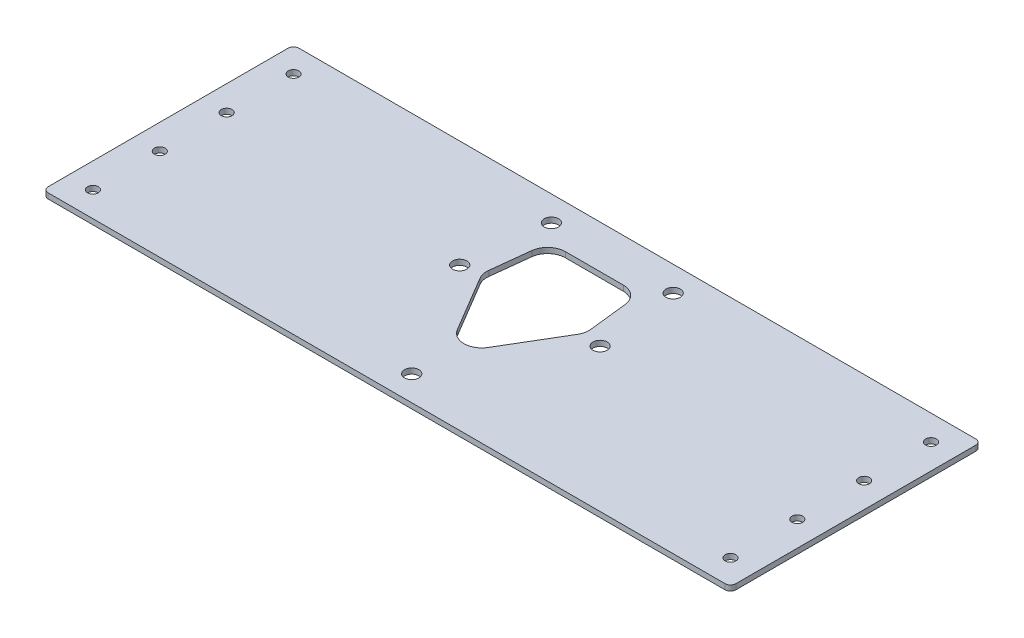
ISO-10303-21;
HEADER;
FILE_DESCRIPTION(('STEP AP214'),'2;1');
FILE_NAME('part.step','',(''),(''),'','','');
FILE_SCHEMA(('AUTOMOTIVE_DESIGN { 1 0 10303 214 1 1 1 1 }'));
ENDSEC;
DATA;
#1=APPLICATION_CONTEXT('core data for automotive mechanical design processes');
#2=APPLICATION_PROTOCOL_DEFINITION('international standard','automotive_design',2000,#1);
#3=PRODUCT_CONTEXT('',#1,'mechanical');
#4=PRODUCT('Part','Part','',(#3));
#5=PRODUCT_RELATED_PRODUCT_CATEGORY('part','',(#4));
#6=PRODUCT_DEFINITION_FORMATION('','',#4);
#7=PRODUCT_DEFINITION_CONTEXT('part definition',#1,'design');
#8=PRODUCT_DEFINITION('design','',#6,#7);
#9=PRODUCT_DEFINITION_SHAPE('','',#8);
#10=(LENGTH_UNIT() NAMED_UNIT(*) SI_UNIT(.MILLI.,.METRE.));
#11=(NAMED_UNIT(*) PLANE_ANGLE_UNIT() SI_UNIT($,.RADIAN.));
#12=(NAMED_UNIT(*) SI_UNIT($,.STERADIAN.) SOLID_ANGLE_UNIT());
#13=UNCERTAINTY_MEASURE_WITH_UNIT(LENGTH_MEASURE(1.E-05),#10,'distance_accuracy_value','');
#14=(GEOMETRIC_REPRESENTATION_CONTEXT(3) GLOBAL_UNCERTAINTY_ASSIGNED_CONTEXT((#13)) GLOBAL_UNIT_ASSIGNED_CONTEXT((#10,
#11,#12)) REPRESENTATION_CONTEXT('',''));
#15=CARTESIAN_POINT('',(0.,0.,0.));
#16=DIRECTION('',(0.,0.,1.));
#17=DIRECTION('',(1.,0.,0.));
#18=AXIS2_PLACEMENT_3D('',#15,#16,#17);
#19=CARTESIAN_POINT('',(0.,3.,0.));
#20=DIRECTION('',(0.,1.,0.));
#21=DIRECTION('',(0.,0.,1.));
#22=AXIS2_PLACEMENT_3D('',#19,#20,#21);
#23=PLANE('',#22);
#24=CARTESIAN_POINT('',(178.,3.,-18.6666666666667));
#25=DIRECTION('',(0.,1.,0.));
#26=DIRECTION('',(0.,0.,-1.));
#27=AXIS2_PLACEMENT_3D('',#24,#25,#26);
#28=CIRCLE('',#27,2.99999999999999);
#29=CARTESIAN_POINT('',(178.,3.,-21.6666666666667));
#30=VERTEX_POINT('',#29);
#31=EDGE_CURVE('E754',#30,#30,#28,.T.);
#32=ORIENTED_EDGE('',*,*,#31,.F.);
#33=EDGE_LOOP('',(#32));
#34=FACE_BOUND('',#33,.T.);
#35=CARTESIAN_POINT('',(-178.,3.,-18.6666666666667));
#36=DIRECTION('',(0.,1.,0.));
#37=DIRECTION('',(0.,0.,1.));
#38=AXIS2_PLACEMENT_3D('',#35,#36,#37);
#39=CIRCLE('',#38,2.99999999999999);
#40=CARTESIAN_POINT('',(-178.,3.,-15.6666666666667));
#41=VERTEX_POINT('',#40);
#42=EDGE_CURVE('E762',#41,#41,#39,.T.);
#43=ORIENTED_EDGE('',*,*,#42,.F.);
#44=EDGE_LOOP('',(#43));
#45=FACE_BOUND('',#44,.T.);
#46=CARTESIAN_POINT('',(-178.,3.,-56.));
#47=DIRECTION('',(0.,1.,0.));
#48=DIRECTION('',(0.,0.,-1.));
#49=AXIS2_PLACEMENT_3D('',#46,#47,#48);
#50=CIRCLE('',#49,2.99999999999999);
#51=CARTESIAN_POINT('',(-178.,3.,-59.));
#52=VERTEX_POINT('',#51);
#53=EDGE_CURVE('E770',#52,#52,#50,.T.);
#54=ORIENTED_EDGE('',*,*,#53,.F.);
#55=EDGE_LOOP('',(#54));
#56=FACE_BOUND('',#55,.T.);
#57=CARTESIAN_POINT('',(-178.,3.,56.));
#58=DIRECTION('',(0.,1.,0.));
#59=DIRECTION('',(0.,0.,1.));
#60=AXIS2_PLACEMENT_3D('',#57,#58,#59);
#61=CIRCLE('',#60,2.99999999999999);
#62=CARTESIAN_POINT('',(-178.,3.,59.));
#63=VERTEX_POINT('',#62);
#64=EDGE_CURVE('E210',#63,#63,#61,.T.);
#65=ORIENTED_EDGE('',*,*,#64,.F.);
#66=EDGE_LOOP('',(#65));
#67=FACE_BOUND('',#66,.T.);
#68=CARTESIAN_POINT('',(39.2,3.,-10.));
#69=DIRECTION('',(0.,1.,0.));
#70=DIRECTION('',(0.,0.,-1.));
#71=AXIS2_PLACEMENT_3D('',#68,#69,#70);
#72=CIRCLE('',#71,4.00000000000001);
#73=CARTESIAN_POINT('',(39.2,3.,-14.));
#74=VERTEX_POINT('',#73);
#75=EDGE_CURVE('E257',#74,#74,#72,.T.);
#76=ORIENTED_EDGE('',*,*,#75,.F.);
#77=EDGE_LOOP('',(#76));
#78=FACE_BOUND('',#77,.T.);
#79=CARTESIAN_POINT('',(-39.2,3.,-9.99999999999999));
#80=DIRECTION('',(0.,1.,0.));
#81=DIRECTION('',(0.,0.,1.));
#82=AXIS2_PLACEMENT_3D('',#79,#80,#81);
#83=CIRCLE('',#82,4.00000000000001);
#84=CARTESIAN_POINT('',(-39.2,3.,-5.99999999999999));
#85=VERTEX_POINT('',#84);
#86=EDGE_CURVE('E269',#85,#85,#83,.T.);
#87=ORIENTED_EDGE('',*,*,#86,.F.);
#88=EDGE_LOOP('',(#87));
#89=FACE_BOUND('',#88,.T.);
#90=DIRECTION('',(-1.,0.,0.));
#91=VECTOR('',#90,1.);
#92=CARTESIAN_POINT('',(-192.,3.,-70.));
#93=LINE('',#92,#91);
#94=CARTESIAN_POINT('',(189.,3.,-70.));
#95=VERTEX_POINT('',#94);
#96=CARTESIAN_POINT('',(-189.,3.,-70.));
#97=VERTEX_POINT('',#96);
#98=EDGE_CURVE('E284',#95,#97,#93,.T.);
#99=ORIENTED_EDGE('',*,*,#98,.T.);
#100=CARTESIAN_POINT('',(-189.,3.,-67.));
#101=DIRECTION('',(0.,1.,0.));
#102=DIRECTION('',(0.,0.,1.));
#103=AXIS2_PLACEMENT_3D('',#100,#101,#102);
#104=CIRCLE('',#103,3.);
#105=CARTESIAN_POINT('',(-192.,3.,-67.));
#106=VERTEX_POINT('',#105);
#107=EDGE_CURVE('E324',#97,#106,#104,.T.);
#108=ORIENTED_EDGE('',*,*,#107,.T.);
#109=DIRECTION('',(0.,0.,1.));
#110=VECTOR('',#109,1.);
#111=CARTESIAN_POINT('',(-192.,3.,-70.));
#112=LINE('',#111,#110);
#113=CARTESIAN_POINT('',(-192.,3.,67.));
#114=VERTEX_POINT('',#113);
#115=EDGE_CURVE('E288',#106,#114,#112,.T.);
#116=ORIENTED_EDGE('',*,*,#115,.T.);
#117=CARTESIAN_POINT('',(-189.,3.,67.));
#118=DIRECTION('',(0.,1.,0.));
#119=DIRECTION('',(0.,0.,1.));
#120=AXIS2_PLACEMENT_3D('',#117,#118,#119);
#121=CIRCLE('',#120,3.);
#122=CARTESIAN_POINT('',(-189.,3.,70.));
#123=VERTEX_POINT('',#122);
#124=EDGE_CURVE('E58',#114,#123,#121,.T.);
#125=ORIENTED_EDGE('',*,*,#124,.T.);
#126=DIRECTION('',(1.,0.,0.));
#127=VECTOR('',#126,1.);
#128=CARTESIAN_POINT('',(-192.,3.,70.));
#129=LINE('',#128,#127);
#130=CARTESIAN_POINT('',(189.,3.,70.));
#131=VERTEX_POINT('',#130);
#132=EDGE_CURVE('E290',#123,#131,#129,.T.);
#133=ORIENTED_EDGE('',*,*,#132,.T.);
#134=CARTESIAN_POINT('',(189.,3.,67.));
#135=DIRECTION('',(0.,1.,0.));
#136=DIRECTION('',(0.,0.,1.));
#137=AXIS2_PLACEMENT_3D('',#134,#135,#136);
#138=CIRCLE('',#137,3.);
#139=CARTESIAN_POINT('',(192.,3.,67.));
#140=VERTEX_POINT('',#139);
#141=EDGE_CURVE('E320',#131,#140,#138,.T.);
#142=ORIENTED_EDGE('',*,*,#141,.T.);
#143=DIRECTION('',(0.,0.,-1.));
#144=VECTOR('',#143,1.);
#145=CARTESIAN_POINT('',(192.,3.,-70.));
#146=LINE('',#145,#144);
#147=CARTESIAN_POINT('',(192.,3.,-67.));
#148=VERTEX_POINT('',#147);
#149=EDGE_CURVE('E281',#140,#148,#146,.T.);
#150=ORIENTED_EDGE('',*,*,#149,.T.);
#151=CARTESIAN_POINT('',(189.,3.,-67.));
#152=DIRECTION('',(0.,1.,0.));
#153=DIRECTION('',(0.,0.,1.));
#154=AXIS2_PLACEMENT_3D('',#151,#152,#153);
#155=CIRCLE('',#154,3.);
#156=EDGE_CURVE('E322',#148,#95,#155,.T.);
#157=ORIENTED_EDGE('',*,*,#156,.T.);
#158=EDGE_LOOP('',(#99,#108,#116,#125,#133,#142,#150,#157));
#159=FACE_BOUND('',#158,.T.);
#160=CARTESIAN_POINT('',(-34.,3.,-56.));
#161=DIRECTION('',(0.,1.,0.));
#162=DIRECTION('',(0.,0.,1.));
#163=AXIS2_PLACEMENT_3D('',#160,#161,#162);
#164=CIRCLE('',#163,4.);
#165=CARTESIAN_POINT('',(-34.,3.,-52.));
#166=VERTEX_POINT('',#165);
#167=EDGE_CURVE('E275',#166,#166,#164,.T.);
#168=ORIENTED_EDGE('',*,*,#167,.F.);
#169=EDGE_LOOP('',(#168));
#170=FACE_BOUND('',#169,.T.);
#171=CARTESIAN_POINT('',(0.,3.,56.));
#172=DIRECTION('',(0.,1.,0.));
#173=DIRECTION('',(0.,0.,1.));
#174=AXIS2_PLACEMENT_3D('',#171,#172,#173);
#175=CIRCLE('',#174,4.);
#176=CARTESIAN_POINT('',(0.,3.,60.));
#177=VERTEX_POINT('',#176);
#178=EDGE_CURVE('E263',#177,#177,#175,.T.);
#179=ORIENTED_EDGE('',*,*,#178,.F.);
#180=EDGE_LOOP('',(#179));
#181=FACE_BOUND('',#180,.T.);
#182=CARTESIAN_POINT('',(34.,3.,-56.));
#183=DIRECTION('',(0.,1.,0.));
#184=DIRECTION('',(0.,0.,-1.));
#185=AXIS2_PLACEMENT_3D('',#182,#183,#184);
#186=CIRCLE('',#185,3.99999999999999);
#187=CARTESIAN_POINT('',(34.,3.,-60.));
#188=VERTEX_POINT('',#187);
#189=EDGE_CURVE('E251',#188,#188,#186,.T.);
#190=ORIENTED_EDGE('',*,*,#189,.F.);
#191=EDGE_LOOP('',(#190));
#192=FACE_BOUND('',#191,.T.);
#193=DIRECTION('',(0.510659143261206,0.,0.859783251409174));
#194=VECTOR('',#193,1.);
#195=CARTESIAN_POINT('',(-8.59783251409182,3.,21.9415235709565));
#196=LINE('',#195,#194);
#197=CARTESIAN_POINT('',(-27.1692899423675,3.,-9.32674658889544));
#198=VERTEX_POINT('',#197);
#199=CARTESIAN_POINT('',(-8.59783251409182,3.,21.9415235709565));
#200=VERTEX_POINT('',#199);
#201=EDGE_CURVE('E174',#198,#200,#196,.T.);
#202=ORIENTED_EDGE('',*,*,#201,.F.);
#203=CARTESIAN_POINT('',(-18.5714574282758,3.,-14.4333380215075));
#204=DIRECTION('',(0.,1.,0.));
#205=DIRECTION('',(0.,0.,1.));
#206=AXIS2_PLACEMENT_3D('',#203,#204,#205);
#207=CIRCLE('',#206,10.);
#208=CARTESIAN_POINT('',(-28.5081692085094,3.,-15.5566184836209));
#209=VERTEX_POINT('',#208);
#210=EDGE_CURVE('E164',#209,#198,#207,.T.);
#211=ORIENTED_EDGE('',*,*,#210,.F.);
#212=DIRECTION('',(-0.112328046211337,0.,0.993671178023366));
#213=VECTOR('',#212,1.);
#214=CARTESIAN_POINT('',(-28.5081692085094,3.,-15.5566184836209));
#215=LINE('',#214,#213);
#216=CARTESIAN_POINT('',(-26.0701987239842,3.,-37.1232804621133));
#217=VERTEX_POINT('',#216);
#218=EDGE_CURVE('E206',#217,#209,#215,.T.);
#219=ORIENTED_EDGE('',*,*,#218,.F.);
#220=CARTESIAN_POINT('',(-16.1334869437505,3.,-36.));
#221=DIRECTION('',(0.,1.,0.));
#222=DIRECTION('',(0.,0.,-1.));
#223=AXIS2_PLACEMENT_3D('',#220,#221,#222);
#224=CIRCLE('',#223,10.);
#225=CARTESIAN_POINT('',(-16.1334869437505,3.,-46.));
#226=VERTEX_POINT('',#225);
#227=EDGE_CURVE('E203',#226,#217,#224,.T.);
#228=ORIENTED_EDGE('',*,*,#227,.F.);
#229=DIRECTION('',(-1.,0.,0.));
#230=VECTOR('',#229,1.);
#231=CARTESIAN_POINT('',(-16.1334869437505,3.,-46.));
#232=LINE('',#231,#230);
#233=CARTESIAN_POINT('',(16.1334869437505,3.,-46.));
#234=VERTEX_POINT('',#233);
#235=EDGE_CURVE('E201',#234,#226,#232,.T.);
#236=ORIENTED_EDGE('',*,*,#235,.F.);
#237=CARTESIAN_POINT('',(16.1334869437505,3.,-36.));
#238=DIRECTION('',(0.,1.,0.));
#239=DIRECTION('',(0.,0.,-1.));
#240=AXIS2_PLACEMENT_3D('',#237,#238,#239);
#241=CIRCLE('',#240,10.);
#242=CARTESIAN_POINT('',(26.0701987239842,3.,-37.1232804621133));
#243=VERTEX_POINT('',#242);
#244=EDGE_CURVE('E199',#243,#234,#241,.T.);
#245=ORIENTED_EDGE('',*,*,#244,.F.);
#246=DIRECTION('',(-0.112328046211338,0.,-0.993671178023366));
#247=VECTOR('',#246,1.);
#248=CARTESIAN_POINT('',(26.0701987239842,3.,-37.1232804621133));
#249=LINE('',#248,#247);
#250=CARTESIAN_POINT('',(28.5081692085094,3.,-15.556618483621));
#251=VERTEX_POINT('',#250);
#252=EDGE_CURVE('E197',#251,#243,#249,.T.);
#253=ORIENTED_EDGE('',*,*,#252,.F.);
#254=CARTESIAN_POINT('',(18.5714574282758,3.,-14.4333380215075));
#255=DIRECTION('',(0.,1.,0.));
#256=DIRECTION('',(0.,0.,-1.));
#257=AXIS2_PLACEMENT_3D('',#254,#255,#256);
#258=CIRCLE('',#257,10.);
#259=CARTESIAN_POINT('',(27.1692899423675,3.,-9.32674658889544));
#260=VERTEX_POINT('',#259);
#261=EDGE_CURVE('E195',#260,#251,#258,.T.);
#262=ORIENTED_EDGE('',*,*,#261,.F.);
#263=DIRECTION('',(0.510659143261207,0.,-0.859783251409174));
#264=VECTOR('',#263,1.);
#265=CARTESIAN_POINT('',(27.1692899423675,3.,-9.32674658889544));
#266=LINE('',#265,#264);
#267=CARTESIAN_POINT('',(8.59783251409179,3.,21.9415235709565));
#268=VERTEX_POINT('',#267);
#269=EDGE_CURVE('E190',#268,#260,#266,.T.);
#270=ORIENTED_EDGE('',*,*,#269,.F.);
#271=CARTESIAN_POINT('',(0.,3.,16.8349321383445));
#272=DIRECTION('',(0.,1.,0.));
#273=DIRECTION('',(0.,0.,-1.));
#274=AXIS2_PLACEMENT_3D('',#271,#272,#273);
#275=CIRCLE('',#274,10.);
#276=EDGE_CURVE('E188',#200,#268,#275,.T.);
#277=ORIENTED_EDGE('',*,*,#276,.F.);
#278=EDGE_LOOP('',(#202,#211,#219,#228,#236,#245,#253,#262,#270,#277));
#279=FACE_BOUND('',#278,.T.);
#280=CARTESIAN_POINT('',(178.,3.,56.));
#281=DIRECTION('',(0.,1.,0.));
#282=DIRECTION('',(0.,0.,-1.));
#283=AXIS2_PLACEMENT_3D('',#280,#281,#282);
#284=CIRCLE('',#283,2.99999999999999);
#285=CARTESIAN_POINT('',(178.,3.,53.));
#286=VERTEX_POINT('',#285);
#287=EDGE_CURVE('E774',#286,#286,#284,.T.);
#288=ORIENTED_EDGE('',*,*,#287,.F.);
#289=EDGE_LOOP('',(#288));
#290=FACE_BOUND('',#289,.T.);
#291=CARTESIAN_POINT('',(178.,3.,-56.));
#292=DIRECTION('',(0.,1.,0.));
#293=DIRECTION('',(0.,0.,1.));
#294=AXIS2_PLACEMENT_3D('',#291,#292,#293);
#295=CIRCLE('',#294,2.99999999999999);
#296=CARTESIAN_POINT('',(178.,3.,-53.));
#297=VERTEX_POINT('',#296);
#298=EDGE_CURVE('E766',#297,#297,#295,.T.);
#299=ORIENTED_EDGE('',*,*,#298,.F.);
#300=EDGE_LOOP('',(#299));
#301=FACE_BOUND('',#300,.T.);
#302=CARTESIAN_POINT('',(-178.,3.,18.6666666666667));
#303=DIRECTION('',(0.,1.,0.));
#304=DIRECTION('',(0.,0.,-1.));
#305=AXIS2_PLACEMENT_3D('',#302,#303,#304);
#306=CIRCLE('',#305,2.99999999999999);
#307=CARTESIAN_POINT('',(-178.,3.,15.6666666666667));
#308=VERTEX_POINT('',#307);
#309=EDGE_CURVE('E758',#308,#308,#306,.T.);
#310=ORIENTED_EDGE('',*,*,#309,.F.);
#311=EDGE_LOOP('',(#310));
#312=FACE_BOUND('',#311,.T.);
#313=CARTESIAN_POINT('',(178.,3.,18.6666666666666));
#314=DIRECTION('',(0.,1.,0.));
#315=DIRECTION('',(0.,0.,1.));
#316=AXIS2_PLACEMENT_3D('',#313,#314,#315);
#317=CIRCLE('',#316,2.99999999999999);
#318=CARTESIAN_POINT('',(178.,3.,21.6666666666666));
#319=VERTEX_POINT('',#318);
#320=EDGE_CURVE('E749',#319,#319,#317,.T.);
#321=ORIENTED_EDGE('',*,*,#320,.F.);
#322=EDGE_LOOP('',(#321));
#323=FACE_BOUND('',#322,.T.);
#324=ADVANCED_FACE('F38',(#34,#45,#56,#67,#78,#89,#159,#170,#181,#192,#279,#290,#301,#312,#323),
#23,.T.);
#325=CARTESIAN_POINT('',(0.,0.,0.));
#326=DIRECTION('',(0.,1.,0.));
#327=DIRECTION('',(0.,0.,1.));
#328=AXIS2_PLACEMENT_3D('',#325,#326,#327);
#329=PLANE('',#328);
#330=CARTESIAN_POINT('',(34.,0.,-56.));
#331=DIRECTION('',(0.,1.,0.));
#332=DIRECTION('',(0.,0.,-1.));
#333=AXIS2_PLACEMENT_3D('',#330,#331,#332);
#334=CIRCLE('',#333,3.99999999999999);
#335=CARTESIAN_POINT('',(34.,0.,-60.));
#336=VERTEX_POINT('',#335);
#337=EDGE_CURVE('E182',#336,#336,#334,.T.);
#338=ORIENTED_EDGE('',*,*,#337,.T.);
#339=EDGE_LOOP('',(#338));
#340=FACE_BOUND('',#339,.T.);
#341=CARTESIAN_POINT('',(39.2,0.,-10.));
#342=DIRECTION('',(0.,1.,0.));
#343=DIRECTION('',(0.,0.,-1.));
#344=AXIS2_PLACEMENT_3D('',#341,#342,#343);
#345=CIRCLE('',#344,4.00000000000001);
#346=CARTESIAN_POINT('',(39.2,0.,-14.));
#347=VERTEX_POINT('',#346);
#348=EDGE_CURVE('E254',#347,#347,#345,.T.);
#349=ORIENTED_EDGE('',*,*,#348,.T.);
#350=EDGE_LOOP('',(#349));
#351=FACE_BOUND('',#350,.T.);
#352=CARTESIAN_POINT('',(0.,0.,56.));
#353=DIRECTION('',(0.,1.,0.));
#354=DIRECTION('',(0.,0.,1.));
#355=AXIS2_PLACEMENT_3D('',#352,#353,#354);
#356=CIRCLE('',#355,4.);
#357=CARTESIAN_POINT('',(0.,0.,60.));
#358=VERTEX_POINT('',#357);
#359=EDGE_CURVE('E260',#358,#358,#356,.T.);
#360=ORIENTED_EDGE('',*,*,#359,.T.);
#361=EDGE_LOOP('',(#360));
#362=FACE_BOUND('',#361,.T.);
#363=CARTESIAN_POINT('',(-39.2,0.,-9.99999999999999));
#364=DIRECTION('',(0.,1.,0.));
#365=DIRECTION('',(0.,0.,1.));
#366=AXIS2_PLACEMENT_3D('',#363,#364,#365);
#367=CIRCLE('',#366,4.00000000000001);
#368=CARTESIAN_POINT('',(-39.2,0.,-5.99999999999999));
#369=VERTEX_POINT('',#368);
#370=EDGE_CURVE('E266',#369,#369,#367,.T.);
#371=ORIENTED_EDGE('',*,*,#370,.T.);
#372=EDGE_LOOP('',(#371));
#373=FACE_BOUND('',#372,.T.);
#374=CARTESIAN_POINT('',(-34.,0.,-56.));
#375=DIRECTION('',(0.,1.,0.));
#376=DIRECTION('',(0.,0.,1.));
#377=AXIS2_PLACEMENT_3D('',#374,#375,#376);
#378=CIRCLE('',#377,4.);
#379=CARTESIAN_POINT('',(-34.,0.,-52.));
#380=VERTEX_POINT('',#379);
#381=EDGE_CURVE('E272',#380,#380,#378,.T.);
#382=ORIENTED_EDGE('',*,*,#381,.T.);
#383=EDGE_LOOP('',(#382));
#384=FACE_BOUND('',#383,.T.);
#385=DIRECTION('',(0.,0.,1.));
#386=VECTOR('',#385,1.);
#387=CARTESIAN_POINT('',(-192.,0.,-70.));
#388=LINE('',#387,#386);
#389=CARTESIAN_POINT('',(-192.,0.,-67.));
#390=VERTEX_POINT('',#389);
#391=CARTESIAN_POINT('',(-192.,0.,67.));
#392=VERTEX_POINT('',#391);
#393=EDGE_CURVE('E298',#390,#392,#388,.T.);
#394=ORIENTED_EDGE('',*,*,#393,.F.);
#395=CARTESIAN_POINT('',(-189.,0.,-67.));
#396=DIRECTION('',(0.,1.,0.));
#397=DIRECTION('',(0.,0.,1.));
#398=AXIS2_PLACEMENT_3D('',#395,#396,#397);
#399=CIRCLE('',#398,3.);
#400=CARTESIAN_POINT('',(-189.,0.,-70.));
#401=VERTEX_POINT('',#400);
#402=EDGE_CURVE('E312',#390,#401,#399,.F.);
#403=ORIENTED_EDGE('',*,*,#402,.T.);
#404=DIRECTION('',(-1.,0.,0.));
#405=VECTOR('',#404,1.);
#406=CARTESIAN_POINT('',(-192.,0.,-70.));
#407=LINE('',#406,#405);
#408=CARTESIAN_POINT('',(189.,0.,-70.));
#409=VERTEX_POINT('',#408);
#410=EDGE_CURVE('E295',#409,#401,#407,.T.);
#411=ORIENTED_EDGE('',*,*,#410,.F.);
#412=CARTESIAN_POINT('',(189.,0.,-67.));
#413=DIRECTION('',(0.,1.,0.));
#414=DIRECTION('',(0.,0.,1.));
#415=AXIS2_PLACEMENT_3D('',#412,#413,#414);
#416=CIRCLE('',#415,3.);
#417=CARTESIAN_POINT('',(192.,0.,-67.));
#418=VERTEX_POINT('',#417);
#419=EDGE_CURVE('E310',#409,#418,#416,.F.);
#420=ORIENTED_EDGE('',*,*,#419,.T.);
#421=DIRECTION('',(0.,0.,-1.));
#422=VECTOR('',#421,1.);
#423=CARTESIAN_POINT('',(192.,0.,-70.));
#424=LINE('',#423,#422);
#425=CARTESIAN_POINT('',(192.,0.,67.));
#426=VERTEX_POINT('',#425);
#427=EDGE_CURVE('E278',#426,#418,#424,.T.);
#428=ORIENTED_EDGE('',*,*,#427,.F.);
#429=CARTESIAN_POINT('',(189.,0.,67.));
#430=DIRECTION('',(0.,1.,0.));
#431=DIRECTION('',(0.,0.,1.));
#432=AXIS2_PLACEMENT_3D('',#429,#430,#431);
#433=CIRCLE('',#432,3.);
#434=CARTESIAN_POINT('',(189.,0.,70.));
#435=VERTEX_POINT('',#434);
#436=EDGE_CURVE('E308',#426,#435,#433,.F.);
#437=ORIENTED_EDGE('',*,*,#436,.T.);
#438=DIRECTION('',(1.,0.,0.));
#439=VECTOR('',#438,1.);
#440=CARTESIAN_POINT('',(-192.,0.,70.));
#441=LINE('',#440,#439);
#442=CARTESIAN_POINT('',(-189.,0.,70.));
#443=VERTEX_POINT('',#442);
#444=EDGE_CURVE('E285',#443,#435,#441,.T.);
#445=ORIENTED_EDGE('',*,*,#444,.F.);
#446=CARTESIAN_POINT('',(-189.,0.,67.));
#447=DIRECTION('',(0.,1.,0.));
#448=DIRECTION('',(0.,0.,1.));
#449=AXIS2_PLACEMENT_3D('',#446,#447,#448);
#450=CIRCLE('',#449,3.);
#451=EDGE_CURVE('E306',#443,#392,#450,.F.);
#452=ORIENTED_EDGE('',*,*,#451,.T.);
#453=EDGE_LOOP('',(#394,#403,#411,#420,#428,#437,#445,#452));
#454=FACE_BOUND('',#453,.T.);
#455=CARTESIAN_POINT('',(-18.5714574282758,0.,-14.4333380215075));
#456=DIRECTION('',(0.,1.,0.));
#457=DIRECTION('',(0.,0.,1.));
#458=AXIS2_PLACEMENT_3D('',#455,#456,#457);
#459=CIRCLE('',#458,10.);
#460=CARTESIAN_POINT('',(-28.5081692085094,0.,-15.5566184836209));
#461=VERTEX_POINT('',#460);
#462=CARTESIAN_POINT('',(-27.1692899423675,0.,-9.32674658889544));
#463=VERTEX_POINT('',#462);
#464=EDGE_CURVE('E208',#461,#463,#459,.T.);
#465=ORIENTED_EDGE('',*,*,#464,.T.);
#466=DIRECTION('',(0.510659143261206,0.,0.859783251409174));
#467=VECTOR('',#466,1.);
#468=CARTESIAN_POINT('',(-8.59783251409182,0.,21.9415235709565));
#469=LINE('',#468,#467);
#470=CARTESIAN_POINT('',(-8.59783251409182,0.,21.9415235709565));
#471=VERTEX_POINT('',#470);
#472=EDGE_CURVE('E181',#463,#471,#469,.T.);
#473=ORIENTED_EDGE('',*,*,#472,.T.);
#474=CARTESIAN_POINT('',(0.,0.,16.8349321383445));
#475=DIRECTION('',(0.,1.,0.));
#476=DIRECTION('',(0.,0.,-1.));
#477=AXIS2_PLACEMENT_3D('',#474,#475,#476);
#478=CIRCLE('',#477,10.);
#479=CARTESIAN_POINT('',(8.59783251409179,0.,21.9415235709565));
#480=VERTEX_POINT('',#479);
#481=EDGE_CURVE('E212',#471,#480,#478,.T.);
#482=ORIENTED_EDGE('',*,*,#481,.T.);
#483=DIRECTION('',(0.510659143261207,0.,-0.859783251409174));
#484=VECTOR('',#483,1.);
#485=CARTESIAN_POINT('',(27.1692899423675,0.,-9.32674658889544));
#486=LINE('',#485,#484);
#487=CARTESIAN_POINT('',(27.1692899423675,0.,-9.32674658889544));
#488=VERTEX_POINT('',#487);
#489=EDGE_CURVE('E215',#480,#488,#486,.T.);
#490=ORIENTED_EDGE('',*,*,#489,.T.);
#491=CARTESIAN_POINT('',(18.5714574282758,0.,-14.4333380215075));
#492=DIRECTION('',(0.,1.,0.));
#493=DIRECTION('',(0.,0.,-1.));
#494=AXIS2_PLACEMENT_3D('',#491,#492,#493);
#495=CIRCLE('',#494,10.);
#496=CARTESIAN_POINT('',(28.5081692085094,0.,-15.556618483621));
#497=VERTEX_POINT('',#496);
#498=EDGE_CURVE('E218',#488,#497,#495,.T.);
#499=ORIENTED_EDGE('',*,*,#498,.T.);
#500=DIRECTION('',(-0.112328046211338,0.,-0.993671178023366));
#501=VECTOR('',#500,1.);
#502=CARTESIAN_POINT('',(26.0701987239842,0.,-37.1232804621133));
#503=LINE('',#502,#501);
#504=CARTESIAN_POINT('',(26.0701987239842,0.,-37.1232804621133));
#505=VERTEX_POINT('',#504);
#506=EDGE_CURVE('E221',#497,#505,#503,.T.);
#507=ORIENTED_EDGE('',*,*,#506,.T.);
#508=CARTESIAN_POINT('',(16.1334869437505,0.,-36.));
#509=DIRECTION('',(0.,1.,0.));
#510=DIRECTION('',(0.,0.,-1.));
#511=AXIS2_PLACEMENT_3D('',#508,#509,#510);
#512=CIRCLE('',#511,10.);
#513=CARTESIAN_POINT('',(16.1334869437505,0.,-46.));
#514=VERTEX_POINT('',#513);
#515=EDGE_CURVE('E224',#505,#514,#512,.T.);
#516=ORIENTED_EDGE('',*,*,#515,.T.);
#517=DIRECTION('',(-1.,0.,0.));
#518=VECTOR('',#517,1.);
#519=CARTESIAN_POINT('',(-16.1334869437505,0.,-46.));
#520=LINE('',#519,#518);
#521=CARTESIAN_POINT('',(-16.1334869437505,0.,-46.));
#522=VERTEX_POINT('',#521);
#523=EDGE_CURVE('E227',#514,#522,#520,.T.);
#524=ORIENTED_EDGE('',*,*,#523,.T.);
#525=CARTESIAN_POINT('',(-16.1334869437505,0.,-36.));
#526=DIRECTION('',(0.,1.,0.));
#527=DIRECTION('',(0.,0.,-1.));
#528=AXIS2_PLACEMENT_3D('',#525,#526,#527);
#529=CIRCLE('',#528,10.);
#530=CARTESIAN_POINT('',(-26.0701987239842,0.,-37.1232804621133));
#531=VERTEX_POINT('',#530);
#532=EDGE_CURVE('E230',#522,#531,#529,.T.);
#533=ORIENTED_EDGE('',*,*,#532,.T.);
#534=DIRECTION('',(-0.112328046211337,0.,0.993671178023366));
#535=VECTOR('',#534,1.);
#536=CARTESIAN_POINT('',(-28.5081692085094,0.,-15.5566184836209));
#537=LINE('',#536,#535);
#538=EDGE_CURVE('E175',#531,#461,#537,.T.);
#539=ORIENTED_EDGE('',*,*,#538,.T.);
#540=EDGE_LOOP('',(#465,#473,#482,#490,#499,#507,#516,#524,#533,#539));
#541=FACE_BOUND('',#540,.T.);
#542=CARTESIAN_POINT('',(-178.,0.,56.));
#543=DIRECTION('',(0.,1.,0.));
#544=DIRECTION('',(0.,0.,1.));
#545=AXIS2_PLACEMENT_3D('',#542,#543,#544);
#546=CIRCLE('',#545,2.99999999999999);
#547=CARTESIAN_POINT('',(-178.,0.,59.));
#548=VERTEX_POINT('',#547);
#549=EDGE_CURVE('E720',#548,#548,#546,.T.);
#550=ORIENTED_EDGE('',*,*,#549,.T.);
#551=EDGE_LOOP('',(#550));
#552=FACE_BOUND('',#551,.T.);
#553=CARTESIAN_POINT('',(178.,0.,56.));
#554=DIRECTION('',(0.,1.,0.));
#555=DIRECTION('',(0.,0.,-1.));
#556=AXIS2_PLACEMENT_3D('',#553,#554,#555);
#557=CIRCLE('',#556,2.99999999999999);
#558=CARTESIAN_POINT('',(178.,0.,53.));
#559=VERTEX_POINT('',#558);
#560=EDGE_CURVE('E724',#559,#559,#557,.T.);
#561=ORIENTED_EDGE('',*,*,#560,.T.);
#562=EDGE_LOOP('',(#561));
#563=FACE_BOUND('',#562,.T.);
#564=CARTESIAN_POINT('',(-178.,0.,-56.));
#565=DIRECTION('',(0.,1.,0.));
#566=DIRECTION('',(0.,0.,-1.));
#567=AXIS2_PLACEMENT_3D('',#564,#565,#566);
#568=CIRCLE('',#567,2.99999999999999);
#569=CARTESIAN_POINT('',(-178.,0.,-59.));
#570=VERTEX_POINT('',#569);
#571=EDGE_CURVE('E728',#570,#570,#568,.T.);
#572=ORIENTED_EDGE('',*,*,#571,.T.);
#573=EDGE_LOOP('',(#572));
#574=FACE_BOUND('',#573,.T.);
#575=CARTESIAN_POINT('',(178.,0.,-56.));
#576=DIRECTION('',(0.,1.,0.));
#577=DIRECTION('',(0.,0.,1.));
#578=AXIS2_PLACEMENT_3D('',#575,#576,#577);
#579=CIRCLE('',#578,2.99999999999999);
#580=CARTESIAN_POINT('',(178.,0.,-53.));
#581=VERTEX_POINT('',#580);
#582=EDGE_CURVE('E732',#581,#581,#579,.T.);
#583=ORIENTED_EDGE('',*,*,#582,.T.);
#584=EDGE_LOOP('',(#583));
#585=FACE_BOUND('',#584,.T.);
#586=CARTESIAN_POINT('',(-178.,0.,-18.6666666666667));
#587=DIRECTION('',(0.,1.,0.));
#588=DIRECTION('',(0.,0.,1.));
#589=AXIS2_PLACEMENT_3D('',#586,#587,#588);
#590=CIRCLE('',#589,2.99999999999999);
#591=CARTESIAN_POINT('',(-178.,0.,-15.6666666666667));
#592=VERTEX_POINT('',#591);
#593=EDGE_CURVE('E736',#592,#592,#590,.T.);
#594=ORIENTED_EDGE('',*,*,#593,.T.);
#595=EDGE_LOOP('',(#594));
#596=FACE_BOUND('',#595,.T.);
#597=CARTESIAN_POINT('',(-178.,0.,18.6666666666667));
#598=DIRECTION('',(0.,1.,0.));
#599=DIRECTION('',(0.,0.,-1.));
#600=AXIS2_PLACEMENT_3D('',#597,#598,#599);
#601=CIRCLE('',#600,2.99999999999999);
#602=CARTESIAN_POINT('',(-178.,0.,15.6666666666667));
#603=VERTEX_POINT('',#602);
#604=EDGE_CURVE('E740',#603,#603,#601,.T.);
#605=ORIENTED_EDGE('',*,*,#604,.T.);
#606=EDGE_LOOP('',(#605));
#607=FACE_BOUND('',#606,.T.);
#608=CARTESIAN_POINT('',(178.,0.,-18.6666666666667));
#609=DIRECTION('',(0.,1.,0.));
#610=DIRECTION('',(0.,0.,-1.));
#611=AXIS2_PLACEMENT_3D('',#608,#609,#610);
#612=CIRCLE('',#611,2.99999999999999);
#613=CARTESIAN_POINT('',(178.,0.,-21.6666666666667));
#614=VERTEX_POINT('',#613);
#615=EDGE_CURVE('E744',#614,#614,#612,.T.);
#616=ORIENTED_EDGE('',*,*,#615,.T.);
#617=EDGE_LOOP('',(#616));
#618=FACE_BOUND('',#617,.T.);
#619=CARTESIAN_POINT('',(178.,0.,18.6666666666666));
#620=DIRECTION('',(0.,1.,0.));
#621=DIRECTION('',(0.,0.,1.));
#622=AXIS2_PLACEMENT_3D('',#619,#620,#621);
#623=CIRCLE('',#622,2.99999999999999);
#624=CARTESIAN_POINT('',(178.,0.,21.6666666666666));
#625=VERTEX_POINT('',#624);
#626=EDGE_CURVE('E747',#625,#625,#623,.T.);
#627=ORIENTED_EDGE('',*,*,#626,.T.);
#628=EDGE_LOOP('',(#627));
#629=FACE_BOUND('',#628,.T.);
#630=ADVANCED_FACE('F337',(#340,#351,#362,#373,#384,#454,#541,#552,#563,#574,#585,#596,#607,
#618,#629),#329,.F.);
#631=CARTESIAN_POINT('',(192.,3.,-70.));
#632=DIRECTION('',(-1.,0.,0.));
#633=DIRECTION('',(0.,0.,1.));
#634=AXIS2_PLACEMENT_3D('',#631,#632,#633);
#635=PLANE('',#634);
#636=ORIENTED_EDGE('',*,*,#427,.T.);
#637=DIRECTION('',(0.,-1.,0.));
#638=VECTOR('',#637,1.);
#639=CARTESIAN_POINT('',(192.,3.,-67.));
#640=LINE('',#639,#638);
#641=EDGE_CURVE('E329',#418,#148,#640,.F.);
#642=ORIENTED_EDGE('',*,*,#641,.T.);
#643=ORIENTED_EDGE('',*,*,#149,.F.);
#644=DIRECTION('',(0.,-1.,0.));
#645=VECTOR('',#644,1.);
#646=CARTESIAN_POINT('',(192.,3.,67.));
#647=LINE('',#646,#645);
#648=EDGE_CURVE('E326',#140,#426,#647,.T.);
#649=ORIENTED_EDGE('',*,*,#648,.T.);
#650=EDGE_LOOP('',(#636,#642,#643,#649));
#651=FACE_BOUND('',#650,.T.);
#652=ADVANCED_FACE('F346',(#651),#635,.F.);
#653=CARTESIAN_POINT('',(-192.,3.,-70.));
#654=DIRECTION('',(0.,0.,1.));
#655=DIRECTION('',(1.,0.,0.));
#656=AXIS2_PLACEMENT_3D('',#653,#654,#655);
#657=PLANE('',#656);
#658=ORIENTED_EDGE('',*,*,#410,.T.);
#659=DIRECTION('',(0.,-1.,0.));
#660=VECTOR('',#659,1.);
#661=CARTESIAN_POINT('',(-189.,3.,-70.));
#662=LINE('',#661,#660);
#663=EDGE_CURVE('E317',#401,#97,#662,.F.);
#664=ORIENTED_EDGE('',*,*,#663,.T.);
#665=ORIENTED_EDGE('',*,*,#98,.F.);
#666=DIRECTION('',(0.,-1.,0.));
#667=VECTOR('',#666,1.);
#668=CARTESIAN_POINT('',(189.,3.,-70.));
#669=LINE('',#668,#667);
#670=EDGE_CURVE('E314',#95,#409,#669,.T.);
#671=ORIENTED_EDGE('',*,*,#670,.T.);
#672=EDGE_LOOP('',(#658,#664,#665,#671));
#673=FACE_BOUND('',#672,.T.);
#674=ADVANCED_FACE('F356',(#673),#657,.F.);
#675=CARTESIAN_POINT('',(-192.,3.,-70.));
#676=DIRECTION('',(1.,0.,0.));
#677=DIRECTION('',(0.,0.,-1.));
#678=AXIS2_PLACEMENT_3D('',#675,#676,#677);
#679=PLANE('',#678);
#680=ORIENTED_EDGE('',*,*,#115,.F.);
#681=DIRECTION('',(0.,-1.,0.));
#682=VECTOR('',#681,1.);
#683=CARTESIAN_POINT('',(-192.,3.,-67.));
#684=LINE('',#683,#682);
#685=EDGE_CURVE('E303',#106,#390,#684,.T.);
#686=ORIENTED_EDGE('',*,*,#685,.T.);
#687=ORIENTED_EDGE('',*,*,#393,.T.);
#688=DIRECTION('',(0.,-1.,0.));
#689=VECTOR('',#688,1.);
#690=CARTESIAN_POINT('',(-192.,3.,67.));
#691=LINE('',#690,#689);
#692=EDGE_CURVE('E292',#392,#114,#691,.F.);
#693=ORIENTED_EDGE('',*,*,#692,.T.);
#694=EDGE_LOOP('',(#680,#686,#687,#693));
#695=FACE_BOUND('',#694,.T.);
#696=ADVANCED_FACE('F364',(#695),#679,.F.);
#697=CARTESIAN_POINT('',(-192.,3.,70.));
#698=DIRECTION('',(0.,0.,-1.));
#699=DIRECTION('',(-1.,0.,0.));
#700=AXIS2_PLACEMENT_3D('',#697,#698,#699);
#701=PLANE('',#700);
#702=ORIENTED_EDGE('',*,*,#444,.T.);
#703=DIRECTION('',(0.,-1.,0.));
#704=VECTOR('',#703,1.);
#705=CARTESIAN_POINT('',(189.,3.,70.));
#706=LINE('',#705,#704);
#707=EDGE_CURVE('E11',#435,#131,#706,.F.);
#708=ORIENTED_EDGE('',*,*,#707,.T.);
#709=ORIENTED_EDGE('',*,*,#132,.F.);
#710=DIRECTION('',(0.,-1.,0.));
#711=VECTOR('',#710,1.);
#712=CARTESIAN_POINT('',(-189.,3.,70.));
#713=LINE('',#712,#711);
#714=EDGE_CURVE('E46',#123,#443,#713,.T.);
#715=ORIENTED_EDGE('',*,*,#714,.T.);
#716=EDGE_LOOP('',(#702,#708,#709,#715));
#717=FACE_BOUND('',#716,.T.);
#718=ADVANCED_FACE('F333',(#717),#701,.F.);
#719=CARTESIAN_POINT('',(-34.,3.,-56.));
#720=DIRECTION('',(0.,-1.,0.));
#721=DIRECTION('',(0.,0.,-1.));
#722=AXIS2_PLACEMENT_3D('',#719,#720,#721);
#723=CYLINDRICAL_SURFACE('',#722,4.);
#724=ORIENTED_EDGE('',*,*,#167,.T.);
#725=EDGE_LOOP('',(#724));
#726=FACE_BOUND('',#725,.T.);
#727=ORIENTED_EDGE('',*,*,#381,.F.);
#728=EDGE_LOOP('',(#727));
#729=FACE_BOUND('',#728,.T.);
#730=ADVANCED_FACE('F381',(#726,#729),#723,.F.);
#731=CARTESIAN_POINT('',(-39.2,3.,-9.99999999999999));
#732=DIRECTION('',(0.,-1.,0.));
#733=DIRECTION('',(0.,0.,-1.));
#734=AXIS2_PLACEMENT_3D('',#731,#732,#733);
#735=CYLINDRICAL_SURFACE('',#734,4.00000000000001);
#736=ORIENTED_EDGE('',*,*,#86,.T.);
#737=EDGE_LOOP('',(#736));
#738=FACE_BOUND('',#737,.T.);
#739=ORIENTED_EDGE('',*,*,#370,.F.);
#740=EDGE_LOOP('',(#739));
#741=FACE_BOUND('',#740,.T.);
#742=ADVANCED_FACE('F601',(#738,#741),#735,.F.);
#743=CARTESIAN_POINT('',(0.,3.,56.));
#744=DIRECTION('',(0.,-1.,0.));
#745=DIRECTION('',(0.,0.,-1.));
#746=AXIS2_PLACEMENT_3D('',#743,#744,#745);
#747=CYLINDRICAL_SURFACE('',#746,4.);
#748=ORIENTED_EDGE('',*,*,#178,.T.);
#749=EDGE_LOOP('',(#748));
#750=FACE_BOUND('',#749,.T.);
#751=ORIENTED_EDGE('',*,*,#359,.F.);
#752=EDGE_LOOP('',(#751));
#753=FACE_BOUND('',#752,.T.);
#754=ADVANCED_FACE('F592',(#750,#753),#747,.F.);
#755=CARTESIAN_POINT('',(39.2,3.,-10.));
#756=DIRECTION('',(0.,-1.,0.));
#757=DIRECTION('',(0.,0.,-1.));
#758=AXIS2_PLACEMENT_3D('',#755,#756,#757);
#759=CYLINDRICAL_SURFACE('',#758,4.00000000000001);
#760=ORIENTED_EDGE('',*,*,#75,.T.);
#761=EDGE_LOOP('',(#760));
#762=FACE_BOUND('',#761,.T.);
#763=ORIENTED_EDGE('',*,*,#348,.F.);
#764=EDGE_LOOP('',(#763));
#765=FACE_BOUND('',#764,.T.);
#766=ADVANCED_FACE('F583',(#762,#765),#759,.F.);
#767=CARTESIAN_POINT('',(34.,3.,-56.));
#768=DIRECTION('',(0.,-1.,0.));
#769=DIRECTION('',(0.,0.,-1.));
#770=AXIS2_PLACEMENT_3D('',#767,#768,#769);
#771=CYLINDRICAL_SURFACE('',#770,3.99999999999999);
#772=ORIENTED_EDGE('',*,*,#189,.T.);
#773=EDGE_LOOP('',(#772));
#774=FACE_BOUND('',#773,.T.);
#775=ORIENTED_EDGE('',*,*,#337,.F.);
#776=EDGE_LOOP('',(#775));
#777=FACE_BOUND('',#776,.T.);
#778=ADVANCED_FACE('F575',(#774,#777),#771,.F.);
#779=CARTESIAN_POINT('',(-18.5714574282758,3.,-14.4333380215075));
#780=DIRECTION('',(0.,-1.,0.));
#781=DIRECTION('',(0.,0.,-1.));
#782=AXIS2_PLACEMENT_3D('',#779,#780,#781);
#783=CYLINDRICAL_SURFACE('',#782,10.);
#784=ORIENTED_EDGE('',*,*,#464,.F.);
#785=DIRECTION('',(0.,-1.,0.));
#786=VECTOR('',#785,1.);
#787=CARTESIAN_POINT('',(-28.5081692085094,3.,-15.5566184836209));
#788=LINE('',#787,#786);
#789=EDGE_CURVE('E170',#209,#461,#788,.T.);
#790=ORIENTED_EDGE('',*,*,#789,.F.);
#791=ORIENTED_EDGE('',*,*,#210,.T.);
#792=DIRECTION('',(0.,-1.,0.));
#793=VECTOR('',#792,1.);
#794=CARTESIAN_POINT('',(-27.1692899423675,3.,-9.32674658889544));
#795=LINE('',#794,#793);
#796=EDGE_CURVE('E167',#198,#463,#795,.T.);
#797=ORIENTED_EDGE('',*,*,#796,.T.);
#798=EDGE_LOOP('',(#784,#790,#791,#797));
#799=FACE_BOUND('',#798,.T.);
#800=ADVANCED_FACE('F166',(#799),#783,.F.);
#801=CARTESIAN_POINT('',(-8.59783251409182,3.,21.9415235709565));
#802=DIRECTION('',(0.859783251409174,0.,-0.510659143261206));
#803=DIRECTION('',(-0.510659143261206,0.,-0.859783251409174));
#804=AXIS2_PLACEMENT_3D('',#801,#802,#803);
#805=PLANE('',#804);
#806=ORIENTED_EDGE('',*,*,#472,.F.);
#807=ORIENTED_EDGE('',*,*,#796,.F.);
#808=ORIENTED_EDGE('',*,*,#201,.T.);
#809=DIRECTION('',(0.,-1.,0.));
#810=VECTOR('',#809,1.);
#811=CARTESIAN_POINT('',(-8.59783251409182,3.,21.9415235709565));
#812=LINE('',#811,#810);
#813=EDGE_CURVE('E183',#200,#471,#812,.T.);
#814=ORIENTED_EDGE('',*,*,#813,.T.);
#815=EDGE_LOOP('',(#806,#807,#808,#814));
#816=FACE_BOUND('',#815,.T.);
#817=ADVANCED_FACE('F178',(#816),#805,.T.);
#818=CARTESIAN_POINT('',(0.,3.,16.8349321383445));
#819=DIRECTION('',(0.,-1.,0.));
#820=DIRECTION('',(0.,0.,-1.));
#821=AXIS2_PLACEMENT_3D('',#818,#819,#820);
#822=CYLINDRICAL_SURFACE('',#821,10.);
#823=ORIENTED_EDGE('',*,*,#481,.F.);
#824=ORIENTED_EDGE('',*,*,#813,.F.);
#825=ORIENTED_EDGE('',*,*,#276,.T.);
#826=DIRECTION('',(0.,-1.,0.));
#827=VECTOR('',#826,1.);
#828=CARTESIAN_POINT('',(8.59783251409179,3.,21.9415235709565));
#829=LINE('',#828,#827);
#830=EDGE_CURVE('E248',#268,#480,#829,.T.);
#831=ORIENTED_EDGE('',*,*,#830,.T.);
#832=EDGE_LOOP('',(#823,#824,#825,#831));
#833=FACE_BOUND('',#832,.T.);
#834=ADVANCED_FACE('F551',(#833),#822,.F.);
#835=CARTESIAN_POINT('',(27.1692899423675,3.,-9.32674658889544));
#836=DIRECTION('',(-0.859783251409173,0.,-0.510659143261207));
#837=DIRECTION('',(-0.510659143261207,0.,0.859783251409174));
#838=AXIS2_PLACEMENT_3D('',#835,#836,#837);
#839=PLANE('',#838);
#840=ORIENTED_EDGE('',*,*,#489,.F.);
#841=ORIENTED_EDGE('',*,*,#830,.F.);
#842=ORIENTED_EDGE('',*,*,#269,.T.);
#843=DIRECTION('',(0.,-1.,0.));
#844=VECTOR('',#843,1.);
#845=CARTESIAN_POINT('',(27.1692899423675,3.,-9.32674658889544));
#846=LINE('',#845,#844);
#847=EDGE_CURVE('E246',#260,#488,#846,.T.);
#848=ORIENTED_EDGE('',*,*,#847,.T.);
#849=EDGE_LOOP('',(#840,#841,#842,#848));
#850=FACE_BOUND('',#849,.T.);
#851=ADVANCED_FACE('F542',(#850),#839,.T.);
#852=CARTESIAN_POINT('',(18.5714574282758,3.,-14.4333380215075));
#853=DIRECTION('',(0.,-1.,0.));
#854=DIRECTION('',(0.,0.,-1.));
#855=AXIS2_PLACEMENT_3D('',#852,#853,#854);
#856=CYLINDRICAL_SURFACE('',#855,10.);
#857=ORIENTED_EDGE('',*,*,#498,.F.);
#858=ORIENTED_EDGE('',*,*,#847,.F.);
#859=ORIENTED_EDGE('',*,*,#261,.T.);
#860=DIRECTION('',(0.,-1.,0.));
#861=VECTOR('',#860,1.);
#862=CARTESIAN_POINT('',(28.5081692085094,3.,-15.556618483621));
#863=LINE('',#862,#861);
#864=EDGE_CURVE('E244',#251,#497,#863,.T.);
#865=ORIENTED_EDGE('',*,*,#864,.T.);
#866=EDGE_LOOP('',(#857,#858,#859,#865));
#867=FACE_BOUND('',#866,.T.);
#868=ADVANCED_FACE('F533',(#867),#856,.F.);
#869=CARTESIAN_POINT('',(26.0701987239842,3.,-37.1232804621133));
#870=DIRECTION('',(-0.993671178023366,0.,0.112328046211338));
#871=DIRECTION('',(0.112328046211338,0.,0.993671178023366));
#872=AXIS2_PLACEMENT_3D('',#869,#870,#871);
#873=PLANE('',#872);
#874=ORIENTED_EDGE('',*,*,#506,.F.);
#875=ORIENTED_EDGE('',*,*,#864,.F.);
#876=ORIENTED_EDGE('',*,*,#252,.T.);
#877=DIRECTION('',(0.,-1.,0.));
#878=VECTOR('',#877,1.);
#879=CARTESIAN_POINT('',(26.0701987239842,3.,-37.1232804621133));
#880=LINE('',#879,#878);
#881=EDGE_CURVE('E242',#243,#505,#880,.T.);
#882=ORIENTED_EDGE('',*,*,#881,.T.);
#883=EDGE_LOOP('',(#874,#875,#876,#882));
#884=FACE_BOUND('',#883,.T.);
#885=ADVANCED_FACE('F524',(#884),#873,.T.);
#886=CARTESIAN_POINT('',(16.1334869437505,3.,-36.));
#887=DIRECTION('',(0.,-1.,0.));
#888=DIRECTION('',(0.,0.,-1.));
#889=AXIS2_PLACEMENT_3D('',#886,#887,#888);
#890=CYLINDRICAL_SURFACE('',#889,10.);
#891=ORIENTED_EDGE('',*,*,#515,.F.);
#892=ORIENTED_EDGE('',*,*,#881,.F.);
#893=ORIENTED_EDGE('',*,*,#244,.T.);
#894=DIRECTION('',(0.,-1.,0.));
#895=VECTOR('',#894,1.);
#896=CARTESIAN_POINT('',(16.1334869437505,3.,-46.));
#897=LINE('',#896,#895);
#898=EDGE_CURVE('E240',#234,#514,#897,.T.);
#899=ORIENTED_EDGE('',*,*,#898,.T.);
#900=EDGE_LOOP('',(#891,#892,#893,#899));
#901=FACE_BOUND('',#900,.T.);
#902=ADVANCED_FACE('F515',(#901),#890,.F.);
#903=CARTESIAN_POINT('',(-16.1334869437505,3.,-46.));
#904=DIRECTION('',(0.,0.,1.));
#905=DIRECTION('',(1.,0.,0.));
#906=AXIS2_PLACEMENT_3D('',#903,#904,#905);
#907=PLANE('',#906);
#908=ORIENTED_EDGE('',*,*,#523,.F.);
#909=ORIENTED_EDGE('',*,*,#898,.F.);
#910=ORIENTED_EDGE('',*,*,#235,.T.);
#911=DIRECTION('',(0.,-1.,0.));
#912=VECTOR('',#911,1.);
#913=CARTESIAN_POINT('',(-16.1334869437505,3.,-46.));
#914=LINE('',#913,#912);
#915=EDGE_CURVE('E238',#226,#522,#914,.T.);
#916=ORIENTED_EDGE('',*,*,#915,.T.);
#917=EDGE_LOOP('',(#908,#909,#910,#916));
#918=FACE_BOUND('',#917,.T.);
#919=ADVANCED_FACE('F506',(#918),#907,.T.);
#920=CARTESIAN_POINT('',(-16.1334869437505,3.,-36.));
#921=DIRECTION('',(0.,-1.,0.));
#922=DIRECTION('',(0.,0.,-1.));
#923=AXIS2_PLACEMENT_3D('',#920,#921,#922);
#924=CYLINDRICAL_SURFACE('',#923,10.);
#925=ORIENTED_EDGE('',*,*,#532,.F.);
#926=ORIENTED_EDGE('',*,*,#915,.F.);
#927=ORIENTED_EDGE('',*,*,#227,.T.);
#928=DIRECTION('',(0.,-1.,0.));
#929=VECTOR('',#928,1.);
#930=CARTESIAN_POINT('',(-26.0701987239842,3.,-37.1232804621133));
#931=LINE('',#930,#929);
#932=EDGE_CURVE('E236',#217,#531,#931,.T.);
#933=ORIENTED_EDGE('',*,*,#932,.T.);
#934=EDGE_LOOP('',(#925,#926,#927,#933));
#935=FACE_BOUND('',#934,.T.);
#936=ADVANCED_FACE('F497',(#935),#924,.F.);
#937=CARTESIAN_POINT('',(-28.5081692085094,3.,-15.5566184836209));
#938=DIRECTION('',(0.993671178023366,0.,0.112328046211337));
#939=DIRECTION('',(0.112328046211337,0.,-0.993671178023366));
#940=AXIS2_PLACEMENT_3D('',#937,#938,#939);
#941=PLANE('',#940);
#942=ORIENTED_EDGE('',*,*,#538,.F.);
#943=ORIENTED_EDGE('',*,*,#932,.F.);
#944=ORIENTED_EDGE('',*,*,#218,.T.);
#945=ORIENTED_EDGE('',*,*,#789,.T.);
#946=EDGE_LOOP('',(#942,#943,#944,#945));
#947=FACE_BOUND('',#946,.T.);
#948=ADVANCED_FACE('F488',(#947),#941,.T.);
#949=CARTESIAN_POINT('',(-178.,3.,56.));
#950=DIRECTION('',(0.,-1.,0.));
#951=DIRECTION('',(0.,0.,-1.));
#952=AXIS2_PLACEMENT_3D('',#949,#950,#951);
#953=CYLINDRICAL_SURFACE('',#952,2.99999999999999);
#954=ORIENTED_EDGE('',*,*,#64,.T.);
#955=EDGE_LOOP('',(#954));
#956=FACE_BOUND('',#955,.T.);
#957=ORIENTED_EDGE('',*,*,#549,.F.);
#958=EDGE_LOOP('',(#957));
#959=FACE_BOUND('',#958,.T.);
#960=ADVANCED_FACE('F479',(#956,#959),#953,.F.);
#961=CARTESIAN_POINT('',(178.,3.,56.));
#962=DIRECTION('',(0.,-1.,0.));
#963=DIRECTION('',(0.,0.,-1.));
#964=AXIS2_PLACEMENT_3D('',#961,#962,#963);
#965=CYLINDRICAL_SURFACE('',#964,2.99999999999999);
#966=ORIENTED_EDGE('',*,*,#287,.T.);
#967=EDGE_LOOP('',(#966));
#968=FACE_BOUND('',#967,.T.);
#969=ORIENTED_EDGE('',*,*,#560,.F.);
#970=EDGE_LOOP('',(#969));
#971=FACE_BOUND('',#970,.T.);
#972=ADVANCED_FACE('F470',(#968,#971),#965,.F.);
#973=CARTESIAN_POINT('',(-178.,3.,-56.));
#974=DIRECTION('',(0.,-1.,0.));
#975=DIRECTION('',(0.,0.,-1.));
#976=AXIS2_PLACEMENT_3D('',#973,#974,#975);
#977=CYLINDRICAL_SURFACE('',#976,2.99999999999999);
#978=ORIENTED_EDGE('',*,*,#53,.T.);
#979=EDGE_LOOP('',(#978));
#980=FACE_BOUND('',#979,.T.);
#981=ORIENTED_EDGE('',*,*,#571,.F.);
#982=EDGE_LOOP('',(#981));
#983=FACE_BOUND('',#982,.T.);
#984=ADVANCED_FACE('F461',(#980,#983),#977,.F.);
#985=CARTESIAN_POINT('',(178.,3.,-56.));
#986=DIRECTION('',(0.,-1.,0.));
#987=DIRECTION('',(0.,0.,-1.));
#988=AXIS2_PLACEMENT_3D('',#985,#986,#987);
#989=CYLINDRICAL_SURFACE('',#988,2.99999999999999);
#990=ORIENTED_EDGE('',*,*,#298,.T.);
#991=EDGE_LOOP('',(#990));
#992=FACE_BOUND('',#991,.T.);
#993=ORIENTED_EDGE('',*,*,#582,.F.);
#994=EDGE_LOOP('',(#993));
#995=FACE_BOUND('',#994,.T.);
#996=ADVANCED_FACE('F452',(#992,#995),#989,.F.);
#997=CARTESIAN_POINT('',(-178.,3.,-18.6666666666667));
#998=DIRECTION('',(0.,-1.,0.));
#999=DIRECTION('',(0.,0.,-1.));
#1000=AXIS2_PLACEMENT_3D('',#997,#998,#999);
#1001=CYLINDRICAL_SURFACE('',#1000,2.99999999999999);
#1002=ORIENTED_EDGE('',*,*,#42,.T.);
#1003=EDGE_LOOP('',(#1002));
#1004=FACE_BOUND('',#1003,.T.);
#1005=ORIENTED_EDGE('',*,*,#593,.F.);
#1006=EDGE_LOOP('',(#1005));
#1007=FACE_BOUND('',#1006,.T.);
#1008=ADVANCED_FACE('F443',(#1004,#1007),#1001,.F.);
#1009=CARTESIAN_POINT('',(-178.,3.,18.6666666666667));
#1010=DIRECTION('',(0.,-1.,0.));
#1011=DIRECTION('',(0.,0.,-1.));
#1012=AXIS2_PLACEMENT_3D('',#1009,#1010,#1011);
#1013=CYLINDRICAL_SURFACE('',#1012,2.99999999999999);
#1014=ORIENTED_EDGE('',*,*,#309,.T.);
#1015=EDGE_LOOP('',(#1014));
#1016=FACE_BOUND('',#1015,.T.);
#1017=ORIENTED_EDGE('',*,*,#604,.F.);
#1018=EDGE_LOOP('',(#1017));
#1019=FACE_BOUND('',#1018,.T.);
#1020=ADVANCED_FACE('F434',(#1016,#1019),#1013,.F.);
#1021=CARTESIAN_POINT('',(178.,3.,-18.6666666666667));
#1022=DIRECTION('',(0.,-1.,0.));
#1023=DIRECTION('',(0.,0.,-1.));
#1024=AXIS2_PLACEMENT_3D('',#1021,#1022,#1023);
#1025=CYLINDRICAL_SURFACE('',#1024,2.99999999999999);
#1026=ORIENTED_EDGE('',*,*,#31,.T.);
#1027=EDGE_LOOP('',(#1026));
#1028=FACE_BOUND('',#1027,.T.);
#1029=ORIENTED_EDGE('',*,*,#615,.F.);
#1030=EDGE_LOOP('',(#1029));
#1031=FACE_BOUND('',#1030,.T.);
#1032=ADVANCED_FACE('F425',(#1028,#1031),#1025,.F.);
#1033=CARTESIAN_POINT('',(178.,3.,18.6666666666666));
#1034=DIRECTION('',(0.,-1.,0.));
#1035=DIRECTION('',(0.,0.,-1.));
#1036=AXIS2_PLACEMENT_3D('',#1033,#1034,#1035);
#1037=CYLINDRICAL_SURFACE('',#1036,2.99999999999999);
#1038=ORIENTED_EDGE('',*,*,#320,.T.);
#1039=EDGE_LOOP('',(#1038));
#1040=FACE_BOUND('',#1039,.T.);
#1041=ORIENTED_EDGE('',*,*,#626,.F.);
#1042=EDGE_LOOP('',(#1041));
#1043=FACE_BOUND('',#1042,.T.);
#1044=ADVANCED_FACE('F394',(#1040,#1043),#1037,.F.);
#1045=CARTESIAN_POINT('',(-189.,3.,-67.));
#1046=DIRECTION('',(0.,-1.,0.));
#1047=DIRECTION('',(0.,0.,-1.));
#1048=AXIS2_PLACEMENT_3D('',#1045,#1046,#1047);
#1049=CYLINDRICAL_SURFACE('',#1048,3.);
#1050=ORIENTED_EDGE('',*,*,#107,.F.);
#1051=ORIENTED_EDGE('',*,*,#663,.F.);
#1052=ORIENTED_EDGE('',*,*,#402,.F.);
#1053=ORIENTED_EDGE('',*,*,#685,.F.);
#1054=EDGE_LOOP('',(#1050,#1051,#1052,#1053));
#1055=FACE_BOUND('',#1054,.T.);
#1056=ADVANCED_FACE('F361',(#1055),#1049,.T.);
#1057=CARTESIAN_POINT('',(189.,3.,-67.));
#1058=DIRECTION('',(0.,-1.,0.));
#1059=DIRECTION('',(0.,0.,-1.));
#1060=AXIS2_PLACEMENT_3D('',#1057,#1058,#1059);
#1061=CYLINDRICAL_SURFACE('',#1060,3.);
#1062=ORIENTED_EDGE('',*,*,#156,.F.);
#1063=ORIENTED_EDGE('',*,*,#641,.F.);
#1064=ORIENTED_EDGE('',*,*,#419,.F.);
#1065=ORIENTED_EDGE('',*,*,#670,.F.);
#1066=EDGE_LOOP('',(#1062,#1063,#1064,#1065));
#1067=FACE_BOUND('',#1066,.T.);
#1068=ADVANCED_FACE('F353',(#1067),#1061,.T.);
#1069=CARTESIAN_POINT('',(189.,3.,67.));
#1070=DIRECTION('',(0.,-1.,0.));
#1071=DIRECTION('',(0.,0.,-1.));
#1072=AXIS2_PLACEMENT_3D('',#1069,#1070,#1071);
#1073=CYLINDRICAL_SURFACE('',#1072,3.);
#1074=ORIENTED_EDGE('',*,*,#141,.F.);
#1075=ORIENTED_EDGE('',*,*,#707,.F.);
#1076=ORIENTED_EDGE('',*,*,#436,.F.);
#1077=ORIENTED_EDGE('',*,*,#648,.F.);
#1078=EDGE_LOOP('',(#1074,#1075,#1076,#1077));
#1079=FACE_BOUND('',#1078,.T.);
#1080=ADVANCED_FACE('F343',(#1079),#1073,.T.);
#1081=CARTESIAN_POINT('',(-189.,3.,67.));
#1082=DIRECTION('',(0.,-1.,0.));
#1083=DIRECTION('',(0.,0.,-1.));
#1084=AXIS2_PLACEMENT_3D('',#1081,#1082,#1083);
#1085=CYLINDRICAL_SURFACE('',#1084,3.);
#1086=ORIENTED_EDGE('',*,*,#124,.F.);
#1087=ORIENTED_EDGE('',*,*,#692,.F.);
#1088=ORIENTED_EDGE('',*,*,#451,.F.);
#1089=ORIENTED_EDGE('',*,*,#714,.F.);
#1090=EDGE_LOOP('',(#1086,#1087,#1088,#1089));
#1091=FACE_BOUND('',#1090,.T.);
#1092=ADVANCED_FACE('F40',(#1091),#1085,.T.);
#1093=CLOSED_SHELL('',(#324,#630,#652,#674,#696,#718,#730,#742,#754,#766,#778,#800,#817,#834,
#851,#868,#885,#902,#919,#936,#948,#960,#972,#984,#996,#1008,#1020,#1032,#1044,#1056,#1068,
#1080,#1092));
#1094=MANIFOLD_SOLID_BREP('B2',#1093);
#1095=ADVANCED_BREP_SHAPE_REPRESENTATION('',(#18,#1094),#14);
#1096=SHAPE_DEFINITION_REPRESENTATION(#9,#1095);
ENDSEC;
END-ISO-10303-21;
